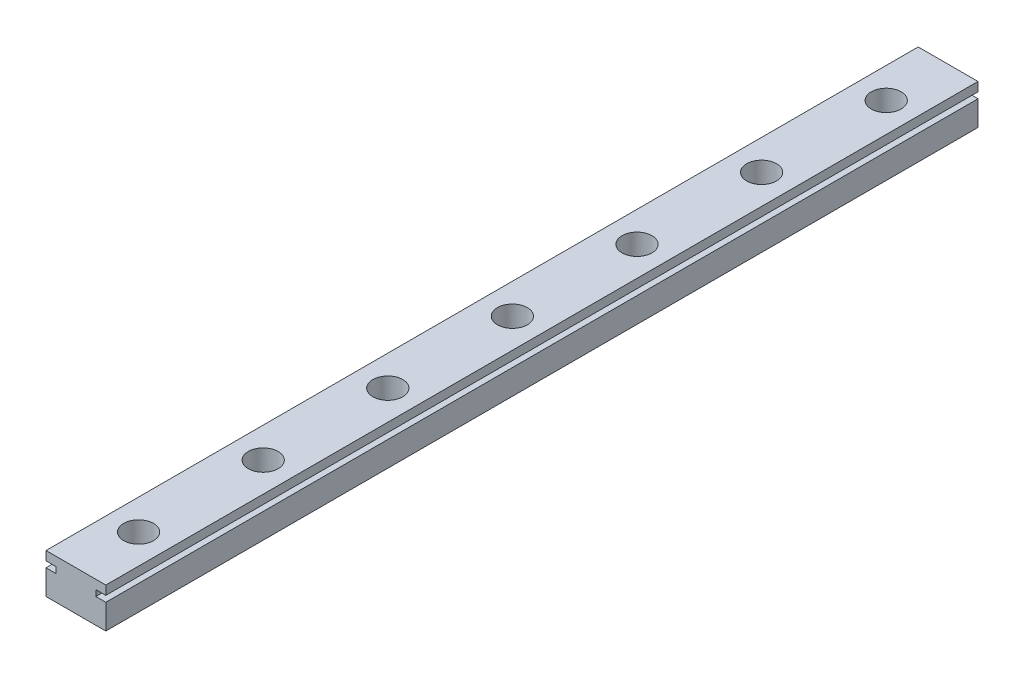
ISO-10303-21;
HEADER;
FILE_DESCRIPTION(('STEP AP214'),'2;1');
FILE_NAME('part.step','',(''),(''),'','','');
FILE_SCHEMA(('AUTOMOTIVE_DESIGN { 1 0 10303 214 1 1 1 1 }'));
ENDSEC;
DATA;
#1=APPLICATION_CONTEXT('core data for automotive mechanical design processes');
#2=APPLICATION_PROTOCOL_DEFINITION('international standard','automotive_design',2000,#1);
#3=PRODUCT_CONTEXT('',#1,'mechanical');
#4=PRODUCT('Part','Part','',(#3));
#5=PRODUCT_RELATED_PRODUCT_CATEGORY('part','',(#4));
#6=PRODUCT_DEFINITION_FORMATION('','',#4);
#7=PRODUCT_DEFINITION_CONTEXT('part definition',#1,'design');
#8=PRODUCT_DEFINITION('design','',#6,#7);
#9=PRODUCT_DEFINITION_SHAPE('','',#8);
#10=(LENGTH_UNIT() NAMED_UNIT(*) SI_UNIT(.MILLI.,.METRE.));
#11=(NAMED_UNIT(*) PLANE_ANGLE_UNIT() SI_UNIT($,.RADIAN.));
#12=(NAMED_UNIT(*) SI_UNIT($,.STERADIAN.) SOLID_ANGLE_UNIT());
#13=UNCERTAINTY_MEASURE_WITH_UNIT(LENGTH_MEASURE(1.E-05),#10,'distance_accuracy_value','');
#14=(GEOMETRIC_REPRESENTATION_CONTEXT(3) GLOBAL_UNCERTAINTY_ASSIGNED_CONTEXT((#13)) GLOBAL_UNIT_ASSIGNED_CONTEXT((#10,
#11,#12)) REPRESENTATION_CONTEXT('',''));
#15=CARTESIAN_POINT('',(0.,0.,0.));
#16=DIRECTION('',(0.,0.,1.));
#17=DIRECTION('',(1.,0.,0.));
#18=AXIS2_PLACEMENT_3D('',#15,#16,#17);
#19=CARTESIAN_POINT('',(-2.28796608925426,1.85114503816794,175.));
#20=DIRECTION('',(1.,0.,0.));
#21=DIRECTION('',(0.,0.,-1.));
#22=AXIS2_PLACEMENT_3D('',#19,#20,#21);
#23=PLANE('',#22);
#24=DIRECTION('',(0.,-1.,0.));
#25=VECTOR('',#24,1.);
#26=CARTESIAN_POINT('',(-2.28796608925426,1.85114503816794,0.));
#27=LINE('',#26,#25);
#28=CARTESIAN_POINT('',(-2.28796608925426,1.85114503816794,0.));
#29=VERTEX_POINT('',#28);
#30=CARTESIAN_POINT('',(-2.28796608925426,-3.14885496183206,0.));
#31=VERTEX_POINT('',#30);
#32=EDGE_CURVE('E156',#29,#31,#27,.T.);
#33=ORIENTED_EDGE('',*,*,#32,.T.);
#34=DIRECTION('',(0.,0.,-1.));
#35=VECTOR('',#34,1.);
#36=CARTESIAN_POINT('',(-2.28796608925426,-3.14885496183206,175.));
#37=LINE('',#36,#35);
#38=CARTESIAN_POINT('',(-2.28796608925426,-3.14885496183206,175.));
#39=VERTEX_POINT('',#38);
#40=EDGE_CURVE('E11',#39,#31,#37,.T.);
#41=ORIENTED_EDGE('',*,*,#40,.F.);
#42=DIRECTION('',(0.,-1.,0.));
#43=VECTOR('',#42,1.);
#44=CARTESIAN_POINT('',(-2.28796608925426,1.85114503816794,175.));
#45=LINE('',#44,#43);
#46=CARTESIAN_POINT('',(-2.28796608925426,1.85114503816794,175.));
#47=VERTEX_POINT('',#46);
#48=EDGE_CURVE('E179',#47,#39,#45,.T.);
#49=ORIENTED_EDGE('',*,*,#48,.F.);
#50=DIRECTION('',(0.,0.,-1.));
#51=VECTOR('',#50,1.);
#52=CARTESIAN_POINT('',(-2.28796608925426,1.85114503816794,175.));
#53=LINE('',#52,#51);
#54=EDGE_CURVE('E152',#47,#29,#53,.T.);
#55=ORIENTED_EDGE('',*,*,#54,.T.);
#56=EDGE_LOOP('',(#33,#41,#49,#55));
#57=FACE_BOUND('',#56,.T.);
#58=ADVANCED_FACE('F36',(#57),#23,.F.);
#59=CARTESIAN_POINT('',(-2.28796608925426,-3.14885496183206,175.));
#60=DIRECTION('',(0.,1.,0.));
#61=DIRECTION('',(0.,0.,1.));
#62=AXIS2_PLACEMENT_3D('',#59,#60,#61);
#63=PLANE('',#62);
#64=CARTESIAN_POINT('',(3.79284197235563,-3.14885496183206,162.5));
#65=DIRECTION('',(0.,1.,0.));
#66=DIRECTION('',(0.,0.,1.));
#67=AXIS2_PLACEMENT_3D('',#64,#65,#66);
#68=CIRCLE('',#67,1.74999999999995);
#69=CARTESIAN_POINT('',(3.79284197235563,-3.14885496183206,164.25));
#70=VERTEX_POINT('',#69);
#71=EDGE_CURVE('E545',#70,#70,#68,.F.);
#72=ORIENTED_EDGE('',*,*,#71,.F.);
#73=EDGE_LOOP('',(#72));
#74=FACE_BOUND('',#73,.T.);
#75=CARTESIAN_POINT('',(3.79284197235554,-3.14885496183206,137.5));
#76=DIRECTION('',(0.,1.,0.));
#77=DIRECTION('',(0.,0.,1.));
#78=AXIS2_PLACEMENT_3D('',#75,#76,#77);
#79=CIRCLE('',#78,1.74999999999998);
#80=CARTESIAN_POINT('',(3.79284197235554,-3.14885496183206,139.25));
#81=VERTEX_POINT('',#80);
#82=EDGE_CURVE('E551',#81,#81,#79,.F.);
#83=ORIENTED_EDGE('',*,*,#82,.F.);
#84=EDGE_LOOP('',(#83));
#85=FACE_BOUND('',#84,.T.);
#86=CARTESIAN_POINT('',(3.79284197235546,-3.14885496183206,112.5));
#87=DIRECTION('',(0.,1.,0.));
#88=DIRECTION('',(0.,0.,1.));
#89=AXIS2_PLACEMENT_3D('',#86,#87,#88);
#90=CIRCLE('',#89,1.74999999999999);
#91=CARTESIAN_POINT('',(3.79284197235546,-3.14885496183206,114.25));
#92=VERTEX_POINT('',#91);
#93=EDGE_CURVE('E557',#92,#92,#90,.F.);
#94=ORIENTED_EDGE('',*,*,#93,.F.);
#95=EDGE_LOOP('',(#94));
#96=FACE_BOUND('',#95,.T.);
#97=CARTESIAN_POINT('',(3.79284197235537,-3.14885496183206,87.5000000000001));
#98=DIRECTION('',(0.,1.,0.));
#99=DIRECTION('',(0.,0.,1.));
#100=AXIS2_PLACEMENT_3D('',#97,#98,#99);
#101=CIRCLE('',#100,1.74999999999999);
#102=CARTESIAN_POINT('',(3.79284197235537,-3.14885496183206,89.2500000000001));
#103=VERTEX_POINT('',#102);
#104=EDGE_CURVE('E563',#103,#103,#101,.F.);
#105=ORIENTED_EDGE('',*,*,#104,.F.);
#106=EDGE_LOOP('',(#105));
#107=FACE_BOUND('',#106,.T.);
#108=CARTESIAN_POINT('',(3.79284197235528,-3.14885496183206,62.5000000000001));
#109=DIRECTION('',(0.,1.,0.));
#110=DIRECTION('',(0.,0.,1.));
#111=AXIS2_PLACEMENT_3D('',#108,#109,#110);
#112=CIRCLE('',#111,1.74999999999999);
#113=CARTESIAN_POINT('',(3.79284197235528,-3.14885496183206,64.2500000000001));
#114=VERTEX_POINT('',#113);
#115=EDGE_CURVE('E569',#114,#114,#112,.F.);
#116=ORIENTED_EDGE('',*,*,#115,.F.);
#117=EDGE_LOOP('',(#116));
#118=FACE_BOUND('',#117,.T.);
#119=CARTESIAN_POINT('',(3.7928419723552,-3.14885496183206,37.5000000000001));
#120=DIRECTION('',(0.,1.,0.));
#121=DIRECTION('',(0.,0.,1.));
#122=AXIS2_PLACEMENT_3D('',#119,#120,#121);
#123=CIRCLE('',#122,1.74999999999999);
#124=CARTESIAN_POINT('',(3.7928419723552,-3.14885496183206,39.2500000000001));
#125=VERTEX_POINT('',#124);
#126=EDGE_CURVE('E575',#125,#125,#123,.F.);
#127=ORIENTED_EDGE('',*,*,#126,.F.);
#128=EDGE_LOOP('',(#127));
#129=FACE_BOUND('',#128,.T.);
#130=CARTESIAN_POINT('',(3.79284197235511,-3.14885496183206,12.5000000000002));
#131=DIRECTION('',(0.,1.,0.));
#132=DIRECTION('',(0.,0.,1.));
#133=AXIS2_PLACEMENT_3D('',#130,#131,#132);
#134=CIRCLE('',#133,1.74999999999999);
#135=CARTESIAN_POINT('',(3.79284197235511,-3.14885496183206,14.2500000000002));
#136=VERTEX_POINT('',#135);
#137=EDGE_CURVE('E581',#136,#136,#134,.F.);
#138=ORIENTED_EDGE('',*,*,#137,.F.);
#139=EDGE_LOOP('',(#138));
#140=FACE_BOUND('',#139,.T.);
#141=DIRECTION('',(1.,0.,0.));
#142=VECTOR('',#141,1.);
#143=CARTESIAN_POINT('',(-2.28796608925426,-3.14885496183206,0.));
#144=LINE('',#143,#142);
#145=CARTESIAN_POINT('',(9.71203391074575,-3.14885496183206,0.));
#146=VERTEX_POINT('',#145);
#147=EDGE_CURVE('E159',#31,#146,#144,.T.);
#148=ORIENTED_EDGE('',*,*,#147,.T.);
#149=DIRECTION('',(0.,0.,-1.));
#150=VECTOR('',#149,1.);
#151=CARTESIAN_POINT('',(9.71203391074575,-3.14885496183206,175.));
#152=LINE('',#151,#150);
#153=CARTESIAN_POINT('',(9.71203391074575,-3.14885496183206,175.));
#154=VERTEX_POINT('',#153);
#155=EDGE_CURVE('E44',#154,#146,#152,.T.);
#156=ORIENTED_EDGE('',*,*,#155,.F.);
#157=DIRECTION('',(1.,0.,0.));
#158=VECTOR('',#157,1.);
#159=CARTESIAN_POINT('',(-2.28796608925426,-3.14885496183206,175.));
#160=LINE('',#159,#158);
#161=EDGE_CURVE('E107',#39,#154,#160,.T.);
#162=ORIENTED_EDGE('',*,*,#161,.F.);
#163=ORIENTED_EDGE('',*,*,#40,.T.);
#164=EDGE_LOOP('',(#148,#156,#162,#163));
#165=FACE_BOUND('',#164,.T.);
#166=ADVANCED_FACE('F257',(#74,#85,#96,#107,#118,#129,#140,#165),#63,.F.);
#167=CARTESIAN_POINT('',(9.71203391074575,-3.14885496183206,175.));
#168=DIRECTION('',(-1.,0.,0.));
#169=DIRECTION('',(0.,0.,1.));
#170=AXIS2_PLACEMENT_3D('',#167,#168,#169);
#171=PLANE('',#170);
#172=DIRECTION('',(0.,1.,0.));
#173=VECTOR('',#172,1.);
#174=CARTESIAN_POINT('',(9.71203391074575,-3.14885496183206,0.));
#175=LINE('',#174,#173);
#176=CARTESIAN_POINT('',(9.71203391074575,1.85114503816794,0.));
#177=VERTEX_POINT('',#176);
#178=EDGE_CURVE('E162',#146,#177,#175,.T.);
#179=ORIENTED_EDGE('',*,*,#178,.T.);
#180=DIRECTION('',(0.,0.,-1.));
#181=VECTOR('',#180,1.);
#182=CARTESIAN_POINT('',(9.71203391074575,1.85114503816794,175.));
#183=LINE('',#182,#181);
#184=CARTESIAN_POINT('',(9.71203391074575,1.85114503816794,175.));
#185=VERTEX_POINT('',#184);
#186=EDGE_CURVE('E198',#185,#177,#183,.T.);
#187=ORIENTED_EDGE('',*,*,#186,.F.);
#188=DIRECTION('',(0.,1.,0.));
#189=VECTOR('',#188,1.);
#190=CARTESIAN_POINT('',(9.71203391074575,-3.14885496183206,175.));
#191=LINE('',#190,#189);
#192=EDGE_CURVE('E206',#154,#185,#191,.T.);
#193=ORIENTED_EDGE('',*,*,#192,.F.);
#194=ORIENTED_EDGE('',*,*,#155,.T.);
#195=EDGE_LOOP('',(#179,#187,#193,#194));
#196=FACE_BOUND('',#195,.T.);
#197=ADVANCED_FACE('F204',(#196),#171,.F.);
#198=CARTESIAN_POINT('',(9.71203391074575,1.85114503816794,175.));
#199=DIRECTION('',(0.,-1.,0.));
#200=DIRECTION('',(1.,0.,0.));
#201=AXIS2_PLACEMENT_3D('',#198,#199,#200);
#202=PLANE('',#201);
#203=DIRECTION('',(-1.,0.,0.));
#204=VECTOR('',#203,1.);
#205=CARTESIAN_POINT('',(9.71203391074575,1.85114503816794,0.));
#206=LINE('',#205,#204);
#207=CARTESIAN_POINT('',(7.71203391074574,1.85114503816794,0.));
#208=VERTEX_POINT('',#207);
#209=EDGE_CURVE('E164',#177,#208,#206,.T.);
#210=ORIENTED_EDGE('',*,*,#209,.T.);
#211=DIRECTION('',(0.,0.,-1.));
#212=VECTOR('',#211,1.);
#213=CARTESIAN_POINT('',(7.71203391074574,1.85114503816794,175.));
#214=LINE('',#213,#212);
#215=CARTESIAN_POINT('',(7.71203391074574,1.85114503816794,175.));
#216=VERTEX_POINT('',#215);
#217=EDGE_CURVE('E195',#216,#208,#214,.T.);
#218=ORIENTED_EDGE('',*,*,#217,.F.);
#219=DIRECTION('',(-1.,0.,0.));
#220=VECTOR('',#219,1.);
#221=CARTESIAN_POINT('',(9.71203391074575,1.85114503816794,175.));
#222=LINE('',#221,#220);
#223=EDGE_CURVE('E224',#185,#216,#222,.T.);
#224=ORIENTED_EDGE('',*,*,#223,.F.);
#225=ORIENTED_EDGE('',*,*,#186,.T.);
#226=EDGE_LOOP('',(#210,#218,#224,#225));
#227=FACE_BOUND('',#226,.T.);
#228=ADVANCED_FACE('F215',(#227),#202,.F.);
#229=CARTESIAN_POINT('',(7.71203391074574,1.85114503816794,175.));
#230=DIRECTION('',(-1.,0.,0.));
#231=DIRECTION('',(0.,0.,1.));
#232=AXIS2_PLACEMENT_3D('',#229,#230,#231);
#233=PLANE('',#232);
#234=DIRECTION('',(0.,1.,0.));
#235=VECTOR('',#234,1.);
#236=CARTESIAN_POINT('',(7.71203391074574,1.85114503816794,0.));
#237=LINE('',#236,#235);
#238=CARTESIAN_POINT('',(7.71203391074574,3.05114503816794,0.));
#239=VERTEX_POINT('',#238);
#240=EDGE_CURVE('E166',#208,#239,#237,.T.);
#241=ORIENTED_EDGE('',*,*,#240,.T.);
#242=DIRECTION('',(0.,0.,-1.));
#243=VECTOR('',#242,1.);
#244=CARTESIAN_POINT('',(7.71203391074574,3.05114503816794,175.));
#245=LINE('',#244,#243);
#246=CARTESIAN_POINT('',(7.71203391074574,3.05114503816794,175.));
#247=VERTEX_POINT('',#246);
#248=EDGE_CURVE('E192',#247,#239,#245,.T.);
#249=ORIENTED_EDGE('',*,*,#248,.F.);
#250=DIRECTION('',(0.,1.,0.));
#251=VECTOR('',#250,1.);
#252=CARTESIAN_POINT('',(7.71203391074574,1.85114503816794,175.));
#253=LINE('',#252,#251);
#254=EDGE_CURVE('E221',#216,#247,#253,.T.);
#255=ORIENTED_EDGE('',*,*,#254,.F.);
#256=ORIENTED_EDGE('',*,*,#217,.T.);
#257=EDGE_LOOP('',(#241,#249,#255,#256));
#258=FACE_BOUND('',#257,.T.);
#259=ADVANCED_FACE('F219',(#258),#233,.F.);
#260=CARTESIAN_POINT('',(7.71203391074574,3.05114503816794,175.));
#261=DIRECTION('',(0.,1.,0.));
#262=DIRECTION('',(0.,0.,1.));
#263=AXIS2_PLACEMENT_3D('',#260,#261,#262);
#264=PLANE('',#263);
#265=DIRECTION('',(1.,0.,0.));
#266=VECTOR('',#265,1.);
#267=CARTESIAN_POINT('',(7.71203391074574,3.05114503816794,0.));
#268=LINE('',#267,#266);
#269=CARTESIAN_POINT('',(9.71203391074575,3.05114503816794,0.));
#270=VERTEX_POINT('',#269);
#271=EDGE_CURVE('E168',#239,#270,#268,.T.);
#272=ORIENTED_EDGE('',*,*,#271,.T.);
#273=DIRECTION('',(0.,0.,-1.));
#274=VECTOR('',#273,1.);
#275=CARTESIAN_POINT('',(9.71203391074575,3.05114503816794,175.));
#276=LINE('',#275,#274);
#277=CARTESIAN_POINT('',(9.71203391074575,3.05114503816794,175.));
#278=VERTEX_POINT('',#277);
#279=EDGE_CURVE('E189',#278,#270,#276,.T.);
#280=ORIENTED_EDGE('',*,*,#279,.F.);
#281=DIRECTION('',(1.,0.,0.));
#282=VECTOR('',#281,1.);
#283=CARTESIAN_POINT('',(7.71203391074574,3.05114503816794,175.));
#284=LINE('',#283,#282);
#285=EDGE_CURVE('E223',#247,#278,#284,.T.);
#286=ORIENTED_EDGE('',*,*,#285,.F.);
#287=ORIENTED_EDGE('',*,*,#248,.T.);
#288=EDGE_LOOP('',(#272,#280,#286,#287));
#289=FACE_BOUND('',#288,.T.);
#290=ADVANCED_FACE('F273',(#289),#264,.F.);
#291=CARTESIAN_POINT('',(9.71203391074575,3.05114503816794,175.));
#292=DIRECTION('',(-1.,0.,0.));
#293=DIRECTION('',(0.,0.,1.));
#294=AXIS2_PLACEMENT_3D('',#291,#292,#293);
#295=PLANE('',#294);
#296=DIRECTION('',(0.,1.,0.));
#297=VECTOR('',#296,1.);
#298=CARTESIAN_POINT('',(9.71203391074575,3.05114503816794,0.));
#299=LINE('',#298,#297);
#300=CARTESIAN_POINT('',(9.71203391074575,4.85114503816794,0.));
#301=VERTEX_POINT('',#300);
#302=EDGE_CURVE('E170',#270,#301,#299,.T.);
#303=ORIENTED_EDGE('',*,*,#302,.T.);
#304=DIRECTION('',(0.,0.,-1.));
#305=VECTOR('',#304,1.);
#306=CARTESIAN_POINT('',(9.71203391074575,4.85114503816794,175.));
#307=LINE('',#306,#305);
#308=CARTESIAN_POINT('',(9.71203391074575,4.85114503816794,175.));
#309=VERTEX_POINT('',#308);
#310=EDGE_CURVE('E186',#309,#301,#307,.T.);
#311=ORIENTED_EDGE('',*,*,#310,.F.);
#312=DIRECTION('',(0.,1.,0.));
#313=VECTOR('',#312,1.);
#314=CARTESIAN_POINT('',(9.71203391074575,3.05114503816794,175.));
#315=LINE('',#314,#313);
#316=EDGE_CURVE('E226',#278,#309,#315,.T.);
#317=ORIENTED_EDGE('',*,*,#316,.F.);
#318=ORIENTED_EDGE('',*,*,#279,.T.);
#319=EDGE_LOOP('',(#303,#311,#317,#318));
#320=FACE_BOUND('',#319,.T.);
#321=ADVANCED_FACE('F276',(#320),#295,.F.);
#322=CARTESIAN_POINT('',(9.71203391074575,4.85114503816794,175.));
#323=DIRECTION('',(0.,-1.,0.));
#324=DIRECTION('',(1.,0.,0.));
#325=AXIS2_PLACEMENT_3D('',#322,#323,#324);
#326=PLANE('',#325);
#327=CARTESIAN_POINT('',(3.79284197235563,4.85114503816794,162.5));
#328=DIRECTION('',(0.,1.,0.));
#329=DIRECTION('',(-1.,0.,0.));
#330=AXIS2_PLACEMENT_3D('',#327,#328,#329);
#331=CIRCLE('',#330,3.);
#332=CARTESIAN_POINT('',(0.792841972355628,4.85114503816794,162.5));
#333=VERTEX_POINT('',#332);
#334=EDGE_CURVE('E591',#333,#333,#331,.T.);
#335=ORIENTED_EDGE('',*,*,#334,.F.);
#336=EDGE_LOOP('',(#335));
#337=FACE_BOUND('',#336,.T.);
#338=CARTESIAN_POINT('',(3.79284197235554,4.85114503816794,137.5));
#339=DIRECTION('',(0.,1.,0.));
#340=DIRECTION('',(-1.,0.,0.));
#341=AXIS2_PLACEMENT_3D('',#338,#339,#340);
#342=CIRCLE('',#341,3.);
#343=CARTESIAN_POINT('',(0.79284197235554,4.85114503816794,137.5));
#344=VERTEX_POINT('',#343);
#345=EDGE_CURVE('E597',#344,#344,#342,.T.);
#346=ORIENTED_EDGE('',*,*,#345,.F.);
#347=EDGE_LOOP('',(#346));
#348=FACE_BOUND('',#347,.T.);
#349=CARTESIAN_POINT('',(3.79284197235546,4.85114503816794,112.5));
#350=DIRECTION('',(0.,1.,0.));
#351=DIRECTION('',(-1.,0.,0.));
#352=AXIS2_PLACEMENT_3D('',#349,#350,#351);
#353=CIRCLE('',#352,3.);
#354=CARTESIAN_POINT('',(0.792841972355453,4.85114503816794,112.5));
#355=VERTEX_POINT('',#354);
#356=EDGE_CURVE('E603',#355,#355,#353,.T.);
#357=ORIENTED_EDGE('',*,*,#356,.F.);
#358=EDGE_LOOP('',(#357));
#359=FACE_BOUND('',#358,.T.);
#360=CARTESIAN_POINT('',(3.79284197235537,4.85114503816794,87.5000000000001));
#361=DIRECTION('',(0.,1.,0.));
#362=DIRECTION('',(-1.,0.,0.));
#363=AXIS2_PLACEMENT_3D('',#360,#361,#362);
#364=CIRCLE('',#363,3.);
#365=CARTESIAN_POINT('',(0.792841972355366,4.85114503816794,87.5000000000001));
#366=VERTEX_POINT('',#365);
#367=EDGE_CURVE('E609',#366,#366,#364,.T.);
#368=ORIENTED_EDGE('',*,*,#367,.F.);
#369=EDGE_LOOP('',(#368));
#370=FACE_BOUND('',#369,.T.);
#371=CARTESIAN_POINT('',(3.79284197235528,4.85114503816794,62.5000000000001));
#372=DIRECTION('',(0.,1.,0.));
#373=DIRECTION('',(-1.,0.,0.));
#374=AXIS2_PLACEMENT_3D('',#371,#372,#373);
#375=CIRCLE('',#374,3.);
#376=CARTESIAN_POINT('',(0.792841972355278,4.85114503816794,62.5000000000001));
#377=VERTEX_POINT('',#376);
#378=EDGE_CURVE('E615',#377,#377,#375,.T.);
#379=ORIENTED_EDGE('',*,*,#378,.F.);
#380=EDGE_LOOP('',(#379));
#381=FACE_BOUND('',#380,.T.);
#382=CARTESIAN_POINT('',(3.79284197235519,4.85114503816794,37.5000000000001));
#383=DIRECTION('',(0.,1.,0.));
#384=DIRECTION('',(-1.,0.,0.));
#385=AXIS2_PLACEMENT_3D('',#382,#383,#384);
#386=CIRCLE('',#385,3.);
#387=CARTESIAN_POINT('',(0.792841972355191,4.85114503816794,37.5000000000001));
#388=VERTEX_POINT('',#387);
#389=EDGE_CURVE('E621',#388,#388,#386,.T.);
#390=ORIENTED_EDGE('',*,*,#389,.F.);
#391=EDGE_LOOP('',(#390));
#392=FACE_BOUND('',#391,.T.);
#393=CARTESIAN_POINT('',(3.79284197235511,4.85114503816794,12.5000000000002));
#394=DIRECTION('',(0.,1.,0.));
#395=DIRECTION('',(-1.,0.,0.));
#396=AXIS2_PLACEMENT_3D('',#393,#394,#395);
#397=CIRCLE('',#396,3.);
#398=CARTESIAN_POINT('',(0.792841972355104,4.85114503816794,12.5000000000002));
#399=VERTEX_POINT('',#398);
#400=EDGE_CURVE('E546',#399,#399,#397,.T.);
#401=ORIENTED_EDGE('',*,*,#400,.F.);
#402=EDGE_LOOP('',(#401));
#403=FACE_BOUND('',#402,.T.);
#404=DIRECTION('',(-1.,0.,0.));
#405=VECTOR('',#404,1.);
#406=CARTESIAN_POINT('',(9.71203391074575,4.85114503816794,0.));
#407=LINE('',#406,#405);
#408=CARTESIAN_POINT('',(-2.28796608925426,4.85114503816794,0.));
#409=VERTEX_POINT('',#408);
#410=EDGE_CURVE('E172',#301,#409,#407,.T.);
#411=ORIENTED_EDGE('',*,*,#410,.T.);
#412=DIRECTION('',(0.,0.,-1.));
#413=VECTOR('',#412,1.);
#414=CARTESIAN_POINT('',(-2.28796608925426,4.85114503816794,175.));
#415=LINE('',#414,#413);
#416=CARTESIAN_POINT('',(-2.28796608925426,4.85114503816794,175.));
#417=VERTEX_POINT('',#416);
#418=EDGE_CURVE('E183',#417,#409,#415,.T.);
#419=ORIENTED_EDGE('',*,*,#418,.F.);
#420=DIRECTION('',(-1.,0.,0.));
#421=VECTOR('',#420,1.);
#422=CARTESIAN_POINT('',(9.71203391074575,4.85114503816794,175.));
#423=LINE('',#422,#421);
#424=EDGE_CURVE('E232',#309,#417,#423,.T.);
#425=ORIENTED_EDGE('',*,*,#424,.F.);
#426=ORIENTED_EDGE('',*,*,#310,.T.);
#427=EDGE_LOOP('',(#411,#419,#425,#426));
#428=FACE_BOUND('',#427,.T.);
#429=ADVANCED_FACE('F238',(#337,#348,#359,#370,#381,#392,#403,#428),#326,.F.);
#430=CARTESIAN_POINT('',(-2.28796608925426,4.85114503816794,175.));
#431=DIRECTION('',(1.,0.,0.));
#432=DIRECTION('',(0.,1.,0.));
#433=AXIS2_PLACEMENT_3D('',#430,#431,#432);
#434=PLANE('',#433);
#435=DIRECTION('',(0.,-1.,0.));
#436=VECTOR('',#435,1.);
#437=CARTESIAN_POINT('',(-2.28796608925426,4.85114503816794,0.));
#438=LINE('',#437,#436);
#439=CARTESIAN_POINT('',(-2.28796608925425,3.05114503816794,0.));
#440=VERTEX_POINT('',#439);
#441=EDGE_CURVE('E174',#409,#440,#438,.T.);
#442=ORIENTED_EDGE('',*,*,#441,.T.);
#443=DIRECTION('',(0.,0.,-1.));
#444=VECTOR('',#443,1.);
#445=CARTESIAN_POINT('',(-2.28796608925425,3.05114503816794,175.));
#446=LINE('',#445,#444);
#447=CARTESIAN_POINT('',(-2.28796608925425,3.05114503816794,175.));
#448=VERTEX_POINT('',#447);
#449=EDGE_CURVE('E147',#448,#440,#446,.T.);
#450=ORIENTED_EDGE('',*,*,#449,.F.);
#451=DIRECTION('',(0.,-1.,0.));
#452=VECTOR('',#451,1.);
#453=CARTESIAN_POINT('',(-2.28796608925426,4.85114503816794,175.));
#454=LINE('',#453,#452);
#455=EDGE_CURVE('E138',#417,#448,#454,.T.);
#456=ORIENTED_EDGE('',*,*,#455,.F.);
#457=ORIENTED_EDGE('',*,*,#418,.T.);
#458=EDGE_LOOP('',(#442,#450,#456,#457));
#459=FACE_BOUND('',#458,.T.);
#460=ADVANCED_FACE('F242',(#459),#434,.F.);
#461=CARTESIAN_POINT('',(-2.28796608925425,3.05114503816794,175.));
#462=DIRECTION('',(0.,1.,0.));
#463=DIRECTION('',(-1.,0.,0.));
#464=AXIS2_PLACEMENT_3D('',#461,#462,#463);
#465=PLANE('',#464);
#466=DIRECTION('',(1.,0.,0.));
#467=VECTOR('',#466,1.);
#468=CARTESIAN_POINT('',(-2.28796608925425,3.05114503816794,0.));
#469=LINE('',#468,#467);
#470=CARTESIAN_POINT('',(-0.287966089254254,3.05114503816794,0.));
#471=VERTEX_POINT('',#470);
#472=EDGE_CURVE('E146',#440,#471,#469,.T.);
#473=ORIENTED_EDGE('',*,*,#472,.T.);
#474=DIRECTION('',(0.,0.,-1.));
#475=VECTOR('',#474,1.);
#476=CARTESIAN_POINT('',(-0.287966089254254,3.05114503816794,175.));
#477=LINE('',#476,#475);
#478=CARTESIAN_POINT('',(-0.287966089254254,3.05114503816794,175.));
#479=VERTEX_POINT('',#478);
#480=EDGE_CURVE('E143',#479,#471,#477,.T.);
#481=ORIENTED_EDGE('',*,*,#480,.F.);
#482=DIRECTION('',(1.,0.,0.));
#483=VECTOR('',#482,1.);
#484=CARTESIAN_POINT('',(-2.28796608925425,3.05114503816794,175.));
#485=LINE('',#484,#483);
#486=EDGE_CURVE('E132',#448,#479,#485,.T.);
#487=ORIENTED_EDGE('',*,*,#486,.F.);
#488=ORIENTED_EDGE('',*,*,#449,.T.);
#489=EDGE_LOOP('',(#473,#481,#487,#488));
#490=FACE_BOUND('',#489,.T.);
#491=ADVANCED_FACE('F144',(#490),#465,.F.);
#492=CARTESIAN_POINT('',(-0.287966089254254,3.05114503816794,175.));
#493=DIRECTION('',(1.,0.,0.));
#494=DIRECTION('',(0.,0.,-1.));
#495=AXIS2_PLACEMENT_3D('',#492,#493,#494);
#496=PLANE('',#495);
#497=DIRECTION('',(0.,-1.,0.));
#498=VECTOR('',#497,1.);
#499=CARTESIAN_POINT('',(-0.287966089254254,3.05114503816794,0.));
#500=LINE('',#499,#498);
#501=CARTESIAN_POINT('',(-0.287966089254254,1.85114503816794,0.));
#502=VERTEX_POINT('',#501);
#503=EDGE_CURVE('E93',#471,#502,#500,.T.);
#504=ORIENTED_EDGE('',*,*,#503,.T.);
#505=DIRECTION('',(0.,0.,-1.));
#506=VECTOR('',#505,1.);
#507=CARTESIAN_POINT('',(-0.287966089254254,1.85114503816794,175.));
#508=LINE('',#507,#506);
#509=CARTESIAN_POINT('',(-0.287966089254254,1.85114503816794,175.));
#510=VERTEX_POINT('',#509);
#511=EDGE_CURVE('E148',#510,#502,#508,.T.);
#512=ORIENTED_EDGE('',*,*,#511,.F.);
#513=DIRECTION('',(0.,-1.,0.));
#514=VECTOR('',#513,1.);
#515=CARTESIAN_POINT('',(-0.287966089254254,3.05114503816794,175.));
#516=LINE('',#515,#514);
#517=EDGE_CURVE('E136',#479,#510,#516,.T.);
#518=ORIENTED_EDGE('',*,*,#517,.F.);
#519=ORIENTED_EDGE('',*,*,#480,.T.);
#520=EDGE_LOOP('',(#504,#512,#518,#519));
#521=FACE_BOUND('',#520,.T.);
#522=ADVANCED_FACE('F150',(#521),#496,.F.);
#523=CARTESIAN_POINT('',(-0.287966089254254,1.85114503816794,175.));
#524=DIRECTION('',(0.,-1.,0.));
#525=DIRECTION('',(1.,0.,0.));
#526=AXIS2_PLACEMENT_3D('',#523,#524,#525);
#527=PLANE('',#526);
#528=DIRECTION('',(-1.,0.,0.));
#529=VECTOR('',#528,1.);
#530=CARTESIAN_POINT('',(-0.287966089254254,1.85114503816794,0.));
#531=LINE('',#530,#529);
#532=EDGE_CURVE('E99',#502,#29,#531,.T.);
#533=ORIENTED_EDGE('',*,*,#532,.T.);
#534=ORIENTED_EDGE('',*,*,#54,.F.);
#535=DIRECTION('',(-1.,0.,0.));
#536=VECTOR('',#535,1.);
#537=CARTESIAN_POINT('',(-0.287966089254254,1.85114503816794,175.));
#538=LINE('',#537,#536);
#539=EDGE_CURVE('E52',#510,#47,#538,.T.);
#540=ORIENTED_EDGE('',*,*,#539,.F.);
#541=ORIENTED_EDGE('',*,*,#511,.T.);
#542=EDGE_LOOP('',(#533,#534,#540,#541));
#543=FACE_BOUND('',#542,.T.);
#544=ADVANCED_FACE('F246',(#543),#527,.F.);
#545=CARTESIAN_POINT('',(0.,0.,175.));
#546=DIRECTION('',(0.,0.,1.));
#547=DIRECTION('',(1.,0.,0.));
#548=AXIS2_PLACEMENT_3D('',#545,#546,#547);
#549=PLANE('',#548);
#550=ORIENTED_EDGE('',*,*,#48,.T.);
#551=ORIENTED_EDGE('',*,*,#161,.T.);
#552=ORIENTED_EDGE('',*,*,#192,.T.);
#553=ORIENTED_EDGE('',*,*,#223,.T.);
#554=ORIENTED_EDGE('',*,*,#254,.T.);
#555=ORIENTED_EDGE('',*,*,#285,.T.);
#556=ORIENTED_EDGE('',*,*,#316,.T.);
#557=ORIENTED_EDGE('',*,*,#424,.T.);
#558=ORIENTED_EDGE('',*,*,#455,.T.);
#559=ORIENTED_EDGE('',*,*,#486,.T.);
#560=ORIENTED_EDGE('',*,*,#517,.T.);
#561=ORIENTED_EDGE('',*,*,#539,.T.);
#562=EDGE_LOOP('',(#550,#551,#552,#553,#554,#555,#556,#557,#558,#559,#560,#561));
#563=FACE_BOUND('',#562,.T.);
#564=ADVANCED_FACE('F134',(#563),#549,.T.);
#565=CARTESIAN_POINT('',(0.,0.,0.));
#566=DIRECTION('',(0.,0.,1.));
#567=DIRECTION('',(1.,0.,0.));
#568=AXIS2_PLACEMENT_3D('',#565,#566,#567);
#569=PLANE('',#568);
#570=ORIENTED_EDGE('',*,*,#32,.F.);
#571=ORIENTED_EDGE('',*,*,#532,.F.);
#572=ORIENTED_EDGE('',*,*,#503,.F.);
#573=ORIENTED_EDGE('',*,*,#472,.F.);
#574=ORIENTED_EDGE('',*,*,#441,.F.);
#575=ORIENTED_EDGE('',*,*,#410,.F.);
#576=ORIENTED_EDGE('',*,*,#302,.F.);
#577=ORIENTED_EDGE('',*,*,#271,.F.);
#578=ORIENTED_EDGE('',*,*,#240,.F.);
#579=ORIENTED_EDGE('',*,*,#209,.F.);
#580=ORIENTED_EDGE('',*,*,#178,.F.);
#581=ORIENTED_EDGE('',*,*,#147,.F.);
#582=EDGE_LOOP('',(#570,#571,#572,#573,#574,#575,#576,#577,#578,#579,#580,#581));
#583=FACE_BOUND('',#582,.T.);
#584=ADVANCED_FACE('F210',(#583),#569,.F.);
#585=CARTESIAN_POINT('',(3.79284197235511,0.351145038167938,12.5000000000002));
#586=DIRECTION('',(0.,1.,0.));
#587=DIRECTION('',(-1.,0.,0.));
#588=AXIS2_PLACEMENT_3D('',#585,#586,#587);
#589=CYLINDRICAL_SURFACE('',#588,3.);
#590=CARTESIAN_POINT('',(3.79284197235511,0.351145038167938,12.5000000000002));
#591=DIRECTION('',(0.,1.,0.));
#592=DIRECTION('',(-1.,0.,0.));
#593=AXIS2_PLACEMENT_3D('',#590,#591,#592);
#594=CIRCLE('',#593,3.);
#595=CARTESIAN_POINT('',(0.792841972355105,0.351145038167938,12.5000000000002));
#596=VERTEX_POINT('',#595);
#597=EDGE_CURVE('E549',#596,#596,#594,.T.);
#598=ORIENTED_EDGE('',*,*,#597,.F.);
#599=EDGE_LOOP('',(#598));
#600=FACE_BOUND('',#599,.T.);
#601=ORIENTED_EDGE('',*,*,#400,.T.);
#602=EDGE_LOOP('',(#601));
#603=FACE_BOUND('',#602,.T.);
#604=ADVANCED_FACE('F314',(#600,#603),#589,.F.);
#605=CARTESIAN_POINT('',(3.79284197235511,0.351145038167938,12.5000000000002));
#606=DIRECTION('',(0.,1.,0.));
#607=DIRECTION('',(-1.,0.,0.));
#608=AXIS2_PLACEMENT_3D('',#605,#606,#607);
#609=PLANE('',#608);
#610=CARTESIAN_POINT('',(3.79284197235511,0.351145038167938,12.5000000000002));
#611=DIRECTION('',(0.,1.,0.));
#612=DIRECTION('',(-1.,0.,0.));
#613=AXIS2_PLACEMENT_3D('',#610,#611,#612);
#614=CIRCLE('',#613,1.74999999999999);
#615=CARTESIAN_POINT('',(2.04284197235512,0.351145038167938,12.5000000000002));
#616=VERTEX_POINT('',#615);
#617=EDGE_CURVE('E584',#616,#616,#614,.T.);
#618=ORIENTED_EDGE('',*,*,#617,.F.);
#619=EDGE_LOOP('',(#618));
#620=FACE_BOUND('',#619,.T.);
#621=ORIENTED_EDGE('',*,*,#597,.T.);
#622=EDGE_LOOP('',(#621));
#623=FACE_BOUND('',#622,.T.);
#624=ADVANCED_FACE('F330',(#620,#623),#609,.T.);
#625=CARTESIAN_POINT('',(3.7928419723552,0.351145038167938,37.5000000000001));
#626=DIRECTION('',(0.,1.,0.));
#627=DIRECTION('',(-1.,0.,0.));
#628=AXIS2_PLACEMENT_3D('',#625,#626,#627);
#629=CYLINDRICAL_SURFACE('',#628,3.);
#630=CARTESIAN_POINT('',(3.7928419723552,0.351145038167938,37.5000000000001));
#631=DIRECTION('',(0.,1.,0.));
#632=DIRECTION('',(-1.,0.,0.));
#633=AXIS2_PLACEMENT_3D('',#630,#631,#632);
#634=CIRCLE('',#633,3.);
#635=CARTESIAN_POINT('',(0.792841972355191,0.351145038167938,37.5000000000001));
#636=VERTEX_POINT('',#635);
#637=EDGE_CURVE('E618',#636,#636,#634,.T.);
#638=ORIENTED_EDGE('',*,*,#637,.F.);
#639=EDGE_LOOP('',(#638));
#640=FACE_BOUND('',#639,.T.);
#641=ORIENTED_EDGE('',*,*,#389,.T.);
#642=EDGE_LOOP('',(#641));
#643=FACE_BOUND('',#642,.T.);
#644=ADVANCED_FACE('F338',(#640,#643),#629,.F.);
#645=CARTESIAN_POINT('',(3.7928419723552,0.351145038167938,37.5000000000001));
#646=DIRECTION('',(0.,1.,0.));
#647=DIRECTION('',(-1.,0.,0.));
#648=AXIS2_PLACEMENT_3D('',#645,#646,#647);
#649=PLANE('',#648);
#650=CARTESIAN_POINT('',(3.7928419723552,0.351145038167938,37.5000000000001));
#651=DIRECTION('',(0.,1.,0.));
#652=DIRECTION('',(-1.,0.,0.));
#653=AXIS2_PLACEMENT_3D('',#650,#651,#652);
#654=CIRCLE('',#653,1.74999999999999);
#655=CARTESIAN_POINT('',(2.04284197235521,0.351145038167938,37.5000000000001));
#656=VERTEX_POINT('',#655);
#657=EDGE_CURVE('E578',#656,#656,#654,.T.);
#658=ORIENTED_EDGE('',*,*,#657,.F.);
#659=EDGE_LOOP('',(#658));
#660=FACE_BOUND('',#659,.T.);
#661=ORIENTED_EDGE('',*,*,#637,.T.);
#662=EDGE_LOOP('',(#661));
#663=FACE_BOUND('',#662,.T.);
#664=ADVANCED_FACE('F343',(#660,#663),#649,.T.);
#665=CARTESIAN_POINT('',(3.79284197235528,0.351145038167938,62.5000000000001));
#666=DIRECTION('',(0.,1.,0.));
#667=DIRECTION('',(-1.,0.,0.));
#668=AXIS2_PLACEMENT_3D('',#665,#666,#667);
#669=CYLINDRICAL_SURFACE('',#668,3.);
#670=CARTESIAN_POINT('',(3.79284197235528,0.351145038167938,62.5000000000001));
#671=DIRECTION('',(0.,1.,0.));
#672=DIRECTION('',(-1.,0.,0.));
#673=AXIS2_PLACEMENT_3D('',#670,#671,#672);
#674=CIRCLE('',#673,3.);
#675=CARTESIAN_POINT('',(0.792841972355279,0.351145038167938,62.5000000000001));
#676=VERTEX_POINT('',#675);
#677=EDGE_CURVE('E612',#676,#676,#674,.T.);
#678=ORIENTED_EDGE('',*,*,#677,.F.);
#679=EDGE_LOOP('',(#678));
#680=FACE_BOUND('',#679,.T.);
#681=ORIENTED_EDGE('',*,*,#378,.T.);
#682=EDGE_LOOP('',(#681));
#683=FACE_BOUND('',#682,.T.);
#684=ADVANCED_FACE('F351',(#680,#683),#669,.F.);
#685=CARTESIAN_POINT('',(3.79284197235528,0.351145038167938,62.5000000000001));
#686=DIRECTION('',(0.,1.,0.));
#687=DIRECTION('',(-1.,0.,0.));
#688=AXIS2_PLACEMENT_3D('',#685,#686,#687);
#689=PLANE('',#688);
#690=CARTESIAN_POINT('',(3.79284197235528,0.351145038167938,62.5000000000001));
#691=DIRECTION('',(0.,1.,0.));
#692=DIRECTION('',(-1.,0.,0.));
#693=AXIS2_PLACEMENT_3D('',#690,#691,#692);
#694=CIRCLE('',#693,1.74999999999999);
#695=CARTESIAN_POINT('',(2.04284197235529,0.351145038167938,62.5000000000001));
#696=VERTEX_POINT('',#695);
#697=EDGE_CURVE('E572',#696,#696,#694,.T.);
#698=ORIENTED_EDGE('',*,*,#697,.F.);
#699=EDGE_LOOP('',(#698));
#700=FACE_BOUND('',#699,.T.);
#701=ORIENTED_EDGE('',*,*,#677,.T.);
#702=EDGE_LOOP('',(#701));
#703=FACE_BOUND('',#702,.T.);
#704=ADVANCED_FACE('F356',(#700,#703),#689,.T.);
#705=CARTESIAN_POINT('',(3.79284197235537,0.351145038167938,87.5000000000001));
#706=DIRECTION('',(0.,1.,0.));
#707=DIRECTION('',(-1.,0.,0.));
#708=AXIS2_PLACEMENT_3D('',#705,#706,#707);
#709=CYLINDRICAL_SURFACE('',#708,3.);
#710=CARTESIAN_POINT('',(3.79284197235537,0.351145038167938,87.5000000000001));
#711=DIRECTION('',(0.,1.,0.));
#712=DIRECTION('',(-1.,0.,0.));
#713=AXIS2_PLACEMENT_3D('',#710,#711,#712);
#714=CIRCLE('',#713,3.);
#715=CARTESIAN_POINT('',(0.792841972355366,0.351145038167938,87.5000000000001));
#716=VERTEX_POINT('',#715);
#717=EDGE_CURVE('E606',#716,#716,#714,.T.);
#718=ORIENTED_EDGE('',*,*,#717,.F.);
#719=EDGE_LOOP('',(#718));
#720=FACE_BOUND('',#719,.T.);
#721=ORIENTED_EDGE('',*,*,#367,.T.);
#722=EDGE_LOOP('',(#721));
#723=FACE_BOUND('',#722,.T.);
#724=ADVANCED_FACE('F364',(#720,#723),#709,.F.);
#725=CARTESIAN_POINT('',(3.79284197235537,0.351145038167938,87.5000000000001));
#726=DIRECTION('',(0.,1.,0.));
#727=DIRECTION('',(-1.,0.,0.));
#728=AXIS2_PLACEMENT_3D('',#725,#726,#727);
#729=PLANE('',#728);
#730=CARTESIAN_POINT('',(3.79284197235537,0.351145038167938,87.5000000000001));
#731=DIRECTION('',(0.,1.,0.));
#732=DIRECTION('',(-1.,0.,0.));
#733=AXIS2_PLACEMENT_3D('',#730,#731,#732);
#734=CIRCLE('',#733,1.74999999999999);
#735=CARTESIAN_POINT('',(2.04284197235538,0.351145038167938,87.5000000000001));
#736=VERTEX_POINT('',#735);
#737=EDGE_CURVE('E566',#736,#736,#734,.T.);
#738=ORIENTED_EDGE('',*,*,#737,.F.);
#739=EDGE_LOOP('',(#738));
#740=FACE_BOUND('',#739,.T.);
#741=ORIENTED_EDGE('',*,*,#717,.T.);
#742=EDGE_LOOP('',(#741));
#743=FACE_BOUND('',#742,.T.);
#744=ADVANCED_FACE('F369',(#740,#743),#729,.T.);
#745=CARTESIAN_POINT('',(3.79284197235546,0.351145038167938,112.5));
#746=DIRECTION('',(0.,1.,0.));
#747=DIRECTION('',(-1.,0.,0.));
#748=AXIS2_PLACEMENT_3D('',#745,#746,#747);
#749=CYLINDRICAL_SURFACE('',#748,3.);
#750=CARTESIAN_POINT('',(3.79284197235546,0.351145038167938,112.5));
#751=DIRECTION('',(0.,1.,0.));
#752=DIRECTION('',(-1.,0.,0.));
#753=AXIS2_PLACEMENT_3D('',#750,#751,#752);
#754=CIRCLE('',#753,3.);
#755=CARTESIAN_POINT('',(0.792841972355454,0.351145038167938,112.5));
#756=VERTEX_POINT('',#755);
#757=EDGE_CURVE('E600',#756,#756,#754,.T.);
#758=ORIENTED_EDGE('',*,*,#757,.F.);
#759=EDGE_LOOP('',(#758));
#760=FACE_BOUND('',#759,.T.);
#761=ORIENTED_EDGE('',*,*,#356,.T.);
#762=EDGE_LOOP('',(#761));
#763=FACE_BOUND('',#762,.T.);
#764=ADVANCED_FACE('F377',(#760,#763),#749,.F.);
#765=CARTESIAN_POINT('',(3.79284197235546,0.351145038167938,112.5));
#766=DIRECTION('',(0.,1.,0.));
#767=DIRECTION('',(-1.,0.,0.));
#768=AXIS2_PLACEMENT_3D('',#765,#766,#767);
#769=PLANE('',#768);
#770=CARTESIAN_POINT('',(3.79284197235546,0.351145038167938,112.5));
#771=DIRECTION('',(0.,1.,0.));
#772=DIRECTION('',(-1.,0.,0.));
#773=AXIS2_PLACEMENT_3D('',#770,#771,#772);
#774=CIRCLE('',#773,1.74999999999999);
#775=CARTESIAN_POINT('',(2.04284197235547,0.351145038167938,112.5));
#776=VERTEX_POINT('',#775);
#777=EDGE_CURVE('E560',#776,#776,#774,.T.);
#778=ORIENTED_EDGE('',*,*,#777,.F.);
#779=EDGE_LOOP('',(#778));
#780=FACE_BOUND('',#779,.T.);
#781=ORIENTED_EDGE('',*,*,#757,.T.);
#782=EDGE_LOOP('',(#781));
#783=FACE_BOUND('',#782,.T.);
#784=ADVANCED_FACE('F382',(#780,#783),#769,.T.);
#785=CARTESIAN_POINT('',(3.79284197235554,0.351145038167938,137.5));
#786=DIRECTION('',(0.,1.,0.));
#787=DIRECTION('',(-1.,0.,0.));
#788=AXIS2_PLACEMENT_3D('',#785,#786,#787);
#789=CYLINDRICAL_SURFACE('',#788,3.);
#790=CARTESIAN_POINT('',(3.79284197235554,0.351145038167938,137.5));
#791=DIRECTION('',(0.,1.,0.));
#792=DIRECTION('',(-1.,0.,0.));
#793=AXIS2_PLACEMENT_3D('',#790,#791,#792);
#794=CIRCLE('',#793,3.);
#795=CARTESIAN_POINT('',(0.792841972355541,0.351145038167938,137.5));
#796=VERTEX_POINT('',#795);
#797=EDGE_CURVE('E594',#796,#796,#794,.T.);
#798=ORIENTED_EDGE('',*,*,#797,.F.);
#799=EDGE_LOOP('',(#798));
#800=FACE_BOUND('',#799,.T.);
#801=ORIENTED_EDGE('',*,*,#345,.T.);
#802=EDGE_LOOP('',(#801));
#803=FACE_BOUND('',#802,.T.);
#804=ADVANCED_FACE('F390',(#800,#803),#789,.F.);
#805=CARTESIAN_POINT('',(3.79284197235554,0.351145038167938,137.5));
#806=DIRECTION('',(0.,1.,0.));
#807=DIRECTION('',(-1.,0.,0.));
#808=AXIS2_PLACEMENT_3D('',#805,#806,#807);
#809=PLANE('',#808);
#810=CARTESIAN_POINT('',(3.79284197235554,0.351145038167938,137.5));
#811=DIRECTION('',(0.,1.,0.));
#812=DIRECTION('',(-1.,0.,0.));
#813=AXIS2_PLACEMENT_3D('',#810,#811,#812);
#814=CIRCLE('',#813,1.74999999999998);
#815=CARTESIAN_POINT('',(2.04284197235557,0.351145038167938,137.5));
#816=VERTEX_POINT('',#815);
#817=EDGE_CURVE('E554',#816,#816,#814,.T.);
#818=ORIENTED_EDGE('',*,*,#817,.F.);
#819=EDGE_LOOP('',(#818));
#820=FACE_BOUND('',#819,.T.);
#821=ORIENTED_EDGE('',*,*,#797,.T.);
#822=EDGE_LOOP('',(#821));
#823=FACE_BOUND('',#822,.T.);
#824=ADVANCED_FACE('F395',(#820,#823),#809,.T.);
#825=CARTESIAN_POINT('',(3.79284197235563,0.351145038167938,162.5));
#826=DIRECTION('',(0.,1.,0.));
#827=DIRECTION('',(-1.,0.,0.));
#828=AXIS2_PLACEMENT_3D('',#825,#826,#827);
#829=CYLINDRICAL_SURFACE('',#828,3.);
#830=CARTESIAN_POINT('',(3.79284197235563,0.351145038167938,162.5));
#831=DIRECTION('',(0.,1.,0.));
#832=DIRECTION('',(-1.,0.,0.));
#833=AXIS2_PLACEMENT_3D('',#830,#831,#832);
#834=CIRCLE('',#833,3.);
#835=CARTESIAN_POINT('',(0.792841972355628,0.351145038167938,162.5));
#836=VERTEX_POINT('',#835);
#837=EDGE_CURVE('E160',#836,#836,#834,.T.);
#838=ORIENTED_EDGE('',*,*,#837,.F.);
#839=EDGE_LOOP('',(#838));
#840=FACE_BOUND('',#839,.T.);
#841=ORIENTED_EDGE('',*,*,#334,.T.);
#842=EDGE_LOOP('',(#841));
#843=FACE_BOUND('',#842,.T.);
#844=ADVANCED_FACE('F403',(#840,#843),#829,.F.);
#845=CARTESIAN_POINT('',(3.79284197235563,0.351145038167938,162.5));
#846=DIRECTION('',(0.,1.,0.));
#847=DIRECTION('',(-1.,0.,0.));
#848=AXIS2_PLACEMENT_3D('',#845,#846,#847);
#849=PLANE('',#848);
#850=CARTESIAN_POINT('',(3.79284197235563,0.351145038167938,162.5));
#851=DIRECTION('',(0.,1.,0.));
#852=DIRECTION('',(-1.,0.,0.));
#853=AXIS2_PLACEMENT_3D('',#850,#851,#852);
#854=CIRCLE('',#853,1.74999999999995);
#855=CARTESIAN_POINT('',(2.04284197235568,0.351145038167938,162.5));
#856=VERTEX_POINT('',#855);
#857=EDGE_CURVE('E543',#856,#856,#854,.T.);
#858=ORIENTED_EDGE('',*,*,#857,.F.);
#859=EDGE_LOOP('',(#858));
#860=FACE_BOUND('',#859,.T.);
#861=ORIENTED_EDGE('',*,*,#837,.T.);
#862=EDGE_LOOP('',(#861));
#863=FACE_BOUND('',#862,.T.);
#864=ADVANCED_FACE('F407',(#860,#863),#849,.T.);
#865=CARTESIAN_POINT('',(3.79284197235511,-3.14985496183206,12.5000000000002));
#866=DIRECTION('',(0.,1.,0.));
#867=DIRECTION('',(-1.,0.,0.));
#868=AXIS2_PLACEMENT_3D('',#865,#866,#867);
#869=CYLINDRICAL_SURFACE('',#868,1.74999999999999);
#870=ORIENTED_EDGE('',*,*,#617,.T.);
#871=EDGE_LOOP('',(#870));
#872=FACE_BOUND('',#871,.T.);
#873=ORIENTED_EDGE('',*,*,#137,.T.);
#874=EDGE_LOOP('',(#873));
#875=FACE_BOUND('',#874,.T.);
#876=ADVANCED_FACE('F466',(#872,#875),#869,.F.);
#877=CARTESIAN_POINT('',(3.7928419723552,-3.14985496183206,37.5000000000001));
#878=DIRECTION('',(0.,1.,0.));
#879=DIRECTION('',(-1.,0.,0.));
#880=AXIS2_PLACEMENT_3D('',#877,#878,#879);
#881=CYLINDRICAL_SURFACE('',#880,1.74999999999999);
#882=ORIENTED_EDGE('',*,*,#657,.T.);
#883=EDGE_LOOP('',(#882));
#884=FACE_BOUND('',#883,.T.);
#885=ORIENTED_EDGE('',*,*,#126,.T.);
#886=EDGE_LOOP('',(#885));
#887=FACE_BOUND('',#886,.T.);
#888=ADVANCED_FACE('F476',(#884,#887),#881,.F.);
#889=CARTESIAN_POINT('',(3.79284197235528,-3.14985496183206,62.5000000000001));
#890=DIRECTION('',(0.,1.,0.));
#891=DIRECTION('',(-1.,0.,0.));
#892=AXIS2_PLACEMENT_3D('',#889,#890,#891);
#893=CYLINDRICAL_SURFACE('',#892,1.74999999999999);
#894=ORIENTED_EDGE('',*,*,#697,.T.);
#895=EDGE_LOOP('',(#894));
#896=FACE_BOUND('',#895,.T.);
#897=ORIENTED_EDGE('',*,*,#115,.T.);
#898=EDGE_LOOP('',(#897));
#899=FACE_BOUND('',#898,.T.);
#900=ADVANCED_FACE('F486',(#896,#899),#893,.F.);
#901=CARTESIAN_POINT('',(3.79284197235537,-3.14985496183206,87.5000000000001));
#902=DIRECTION('',(0.,1.,0.));
#903=DIRECTION('',(-1.,0.,0.));
#904=AXIS2_PLACEMENT_3D('',#901,#902,#903);
#905=CYLINDRICAL_SURFACE('',#904,1.74999999999999);
#906=ORIENTED_EDGE('',*,*,#737,.T.);
#907=EDGE_LOOP('',(#906));
#908=FACE_BOUND('',#907,.T.);
#909=ORIENTED_EDGE('',*,*,#104,.T.);
#910=EDGE_LOOP('',(#909));
#911=FACE_BOUND('',#910,.T.);
#912=ADVANCED_FACE('F496',(#908,#911),#905,.F.);
#913=CARTESIAN_POINT('',(3.79284197235546,-3.14985496183206,112.5));
#914=DIRECTION('',(0.,1.,0.));
#915=DIRECTION('',(-1.,0.,0.));
#916=AXIS2_PLACEMENT_3D('',#913,#914,#915);
#917=CYLINDRICAL_SURFACE('',#916,1.74999999999999);
#918=ORIENTED_EDGE('',*,*,#777,.T.);
#919=EDGE_LOOP('',(#918));
#920=FACE_BOUND('',#919,.T.);
#921=ORIENTED_EDGE('',*,*,#93,.T.);
#922=EDGE_LOOP('',(#921));
#923=FACE_BOUND('',#922,.T.);
#924=ADVANCED_FACE('F506',(#920,#923),#917,.F.);
#925=CARTESIAN_POINT('',(3.79284197235554,-3.14985496183206,137.5));
#926=DIRECTION('',(0.,1.,0.));
#927=DIRECTION('',(-1.,0.,0.));
#928=AXIS2_PLACEMENT_3D('',#925,#926,#927);
#929=CYLINDRICAL_SURFACE('',#928,1.74999999999998);
#930=ORIENTED_EDGE('',*,*,#817,.T.);
#931=EDGE_LOOP('',(#930));
#932=FACE_BOUND('',#931,.T.);
#933=ORIENTED_EDGE('',*,*,#82,.T.);
#934=EDGE_LOOP('',(#933));
#935=FACE_BOUND('',#934,.T.);
#936=ADVANCED_FACE('F516',(#932,#935),#929,.F.);
#937=CARTESIAN_POINT('',(3.79284197235563,-3.14985496183206,162.5));
#938=DIRECTION('',(0.,1.,0.));
#939=DIRECTION('',(-1.,0.,0.));
#940=AXIS2_PLACEMENT_3D('',#937,#938,#939);
#941=CYLINDRICAL_SURFACE('',#940,1.74999999999995);
#942=ORIENTED_EDGE('',*,*,#857,.T.);
#943=EDGE_LOOP('',(#942));
#944=FACE_BOUND('',#943,.T.);
#945=ORIENTED_EDGE('',*,*,#71,.T.);
#946=EDGE_LOOP('',(#945));
#947=FACE_BOUND('',#946,.T.);
#948=ADVANCED_FACE('F526',(#944,#947),#941,.F.);
#949=CLOSED_SHELL('',(#58,#166,#197,#228,#259,#290,#321,#429,#460,#491,#522,#544,#564,#584,#604,
#624,#644,#664,#684,#704,#724,#744,#764,#784,#804,#824,#844,#864,#876,#888,#900,#912,#924,#936,#948));
#950=MANIFOLD_SOLID_BREP('B2',#949);
#951=ADVANCED_BREP_SHAPE_REPRESENTATION('',(#18,#950),#14);
#952=SHAPE_DEFINITION_REPRESENTATION(#9,#951);
ENDSEC;
END-ISO-10303-21;
